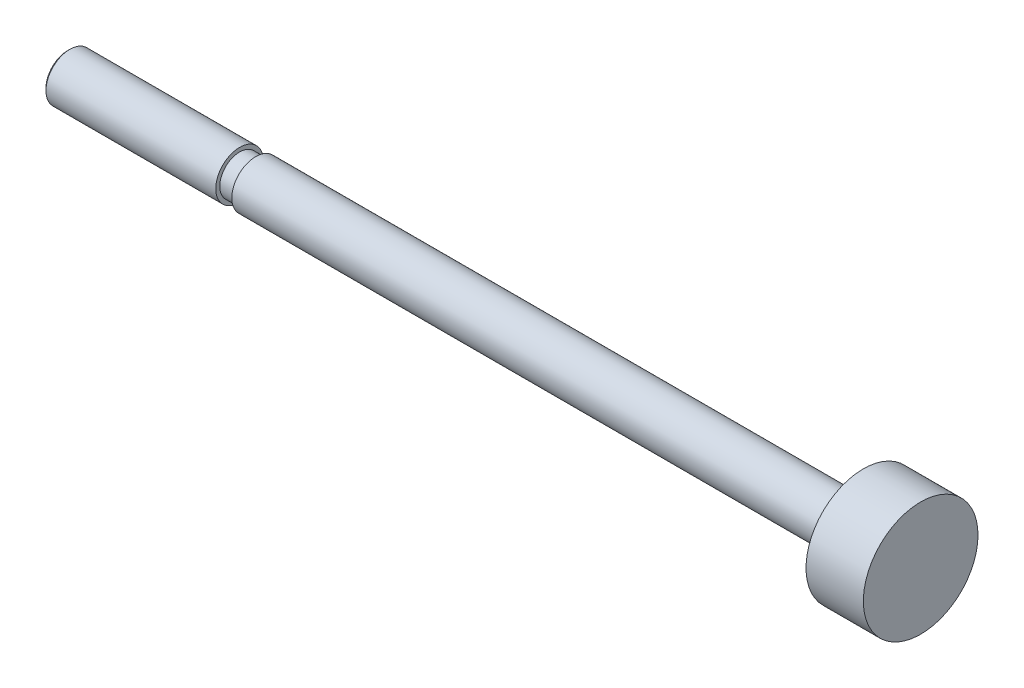
ISO-10303-21;
HEADER;
FILE_DESCRIPTION(('STEP AP214'),'2;1');
FILE_NAME('part.step','',(''),(''),'','','');
FILE_SCHEMA(('AUTOMOTIVE_DESIGN { 1 0 10303 214 1 1 1 1 }'));
ENDSEC;
DATA;
#1=APPLICATION_CONTEXT('core data for automotive mechanical design processes');
#2=APPLICATION_PROTOCOL_DEFINITION('international standard','automotive_design',2000,#1);
#3=PRODUCT_CONTEXT('',#1,'mechanical');
#4=PRODUCT('Part','Part','',(#3));
#5=PRODUCT_RELATED_PRODUCT_CATEGORY('part','',(#4));
#6=PRODUCT_DEFINITION_FORMATION('','',#4);
#7=PRODUCT_DEFINITION_CONTEXT('part definition',#1,'design');
#8=PRODUCT_DEFINITION('design','',#6,#7);
#9=PRODUCT_DEFINITION_SHAPE('','',#8);
#10=(LENGTH_UNIT() NAMED_UNIT(*) SI_UNIT(.MILLI.,.METRE.));
#11=(NAMED_UNIT(*) PLANE_ANGLE_UNIT() SI_UNIT($,.RADIAN.));
#12=(NAMED_UNIT(*) SI_UNIT($,.STERADIAN.) SOLID_ANGLE_UNIT());
#13=UNCERTAINTY_MEASURE_WITH_UNIT(LENGTH_MEASURE(1.E-05),#10,'distance_accuracy_value','');
#14=(GEOMETRIC_REPRESENTATION_CONTEXT(3) GLOBAL_UNCERTAINTY_ASSIGNED_CONTEXT((#13)) GLOBAL_UNIT_ASSIGNED_CONTEXT((#10,
#11,#12)) REPRESENTATION_CONTEXT('',''));
#15=CARTESIAN_POINT('',(0.,0.,0.));
#16=DIRECTION('',(0.,0.,1.));
#17=DIRECTION('',(1.,0.,0.));
#18=AXIS2_PLACEMENT_3D('',#15,#16,#17);
#19=CARTESIAN_POINT('',(-4.99999,0.,0.));
#20=DIRECTION('',(1.,0.,0.));
#21=DIRECTION('',(0.,0.,-1.));
#22=AXIS2_PLACEMENT_3D('',#19,#20,#21);
#23=CYLINDRICAL_SURFACE('',#22,4.99999);
#24=CARTESIAN_POINT('',(-4.99999,0.,0.));
#25=DIRECTION('',(1.,0.,0.));
#26=DIRECTION('',(0.,0.,-1.));
#27=AXIS2_PLACEMENT_3D('',#24,#25,#26);
#28=CIRCLE('',#27,4.99999);
#29=CARTESIAN_POINT('',(-4.99999,0.,-4.99999));
#30=VERTEX_POINT('',#29);
#31=EDGE_CURVE('E59',#30,#30,#28,.T.);
#32=ORIENTED_EDGE('',*,*,#31,.T.);
#33=EDGE_LOOP('',(#32));
#34=FACE_BOUND('',#33,.T.);
#35=CARTESIAN_POINT('',(0.,0.,0.));
#36=DIRECTION('',(1.,0.,0.));
#37=DIRECTION('',(0.,0.,-1.));
#38=AXIS2_PLACEMENT_3D('',#35,#36,#37);
#39=CIRCLE('',#38,4.99999);
#40=CARTESIAN_POINT('',(0.,0.,-4.99999));
#41=VERTEX_POINT('',#40);
#42=EDGE_CURVE('E60',#41,#41,#39,.T.);
#43=ORIENTED_EDGE('',*,*,#42,.F.);
#44=EDGE_LOOP('',(#43));
#45=FACE_BOUND('',#44,.T.);
#46=ADVANCED_FACE('F38',(#34,#45),#23,.T.);
#47=CARTESIAN_POINT('',(-4.99999,0.,0.));
#48=DIRECTION('',(1.,0.,0.));
#49=DIRECTION('',(0.,0.,-1.));
#50=AXIS2_PLACEMENT_3D('',#47,#48,#49);
#51=PLANE('',#50);
#52=CARTESIAN_POINT('',(-4.99999,0.,0.));
#53=DIRECTION('',(1.,0.,0.));
#54=DIRECTION('',(0.,0.,-1.));
#55=AXIS2_PLACEMENT_3D('',#52,#53,#54);
#56=CIRCLE('',#55,2.0828);
#57=CARTESIAN_POINT('',(-4.99999,0.,-2.0828));
#58=VERTEX_POINT('',#57);
#59=EDGE_CURVE('E63',#58,#58,#56,.T.);
#60=ORIENTED_EDGE('',*,*,#59,.T.);
#61=EDGE_LOOP('',(#60));
#62=FACE_BOUND('',#61,.T.);
#63=ORIENTED_EDGE('',*,*,#31,.F.);
#64=EDGE_LOOP('',(#63));
#65=FACE_BOUND('',#64,.T.);
#66=ADVANCED_FACE('F95',(#62,#65),#51,.F.);
#67=CARTESIAN_POINT('',(0.,0.,0.));
#68=DIRECTION('',(1.,0.,0.));
#69=DIRECTION('',(0.,0.,-1.));
#70=AXIS2_PLACEMENT_3D('',#67,#68,#69);
#71=PLANE('',#70);
#72=ORIENTED_EDGE('',*,*,#42,.T.);
#73=EDGE_LOOP('',(#72));
#74=FACE_BOUND('',#73,.T.);
#75=ADVANCED_FACE('F101',(#74),#71,.T.);
#76=CARTESIAN_POINT('',(-57.999884,0.,0.));
#77=DIRECTION('',(1.,0.,0.));
#78=DIRECTION('',(0.,0.,-1.));
#79=AXIS2_PLACEMENT_3D('',#76,#77,#78);
#80=CYLINDRICAL_SURFACE('',#79,2.0828);
#81=CARTESIAN_POINT('',(-57.999884,0.,0.));
#82=DIRECTION('',(1.,0.,0.));
#83=DIRECTION('',(0.,0.,-1.));
#84=AXIS2_PLACEMENT_3D('',#81,#82,#83);
#85=CIRCLE('',#84,2.0828);
#86=CARTESIAN_POINT('',(-57.999884,0.,-2.0828));
#87=VERTEX_POINT('',#86);
#88=EDGE_CURVE('E68',#87,#87,#85,.T.);
#89=ORIENTED_EDGE('',*,*,#88,.T.);
#90=EDGE_LOOP('',(#89));
#91=FACE_BOUND('',#90,.T.);
#92=ORIENTED_EDGE('',*,*,#59,.F.);
#93=EDGE_LOOP('',(#92));
#94=FACE_BOUND('',#93,.T.);
#95=ADVANCED_FACE('F124',(#91,#94),#80,.T.);
#96=CARTESIAN_POINT('',(-57.999884,0.,0.));
#97=DIRECTION('',(1.,0.,0.));
#98=DIRECTION('',(0.,0.,-1.));
#99=AXIS2_PLACEMENT_3D('',#96,#97,#98);
#100=PLANE('',#99);
#101=CARTESIAN_POINT('',(-57.999884,0.,0.));
#102=DIRECTION('',(1.,0.,0.));
#103=DIRECTION('',(0.,0.,-1.));
#104=AXIS2_PLACEMENT_3D('',#101,#102,#103);
#105=CIRCLE('',#104,1.929511);
#106=CARTESIAN_POINT('',(-57.999884,0.,-1.929511));
#107=VERTEX_POINT('',#106);
#108=EDGE_CURVE('E54',#107,#107,#105,.T.);
#109=ORIENTED_EDGE('',*,*,#108,.T.);
#110=EDGE_LOOP('',(#109));
#111=FACE_BOUND('',#110,.T.);
#112=ORIENTED_EDGE('',*,*,#88,.F.);
#113=EDGE_LOOP('',(#112));
#114=FACE_BOUND('',#113,.T.);
#115=ADVANCED_FACE('F90',(#111,#114),#100,.F.);
#116=CARTESIAN_POINT('',(-59.399678,0.,0.));
#117=DIRECTION('',(1.,0.,0.));
#118=DIRECTION('',(0.,0.,-1.));
#119=AXIS2_PLACEMENT_3D('',#116,#117,#118);
#120=CYLINDRICAL_SURFACE('',#119,1.732788);
#121=CARTESIAN_POINT('',(-58.196607,0.,0.));
#122=DIRECTION('',(1.,0.,0.));
#123=DIRECTION('',(0.,0.,-1.));
#124=AXIS2_PLACEMENT_3D('',#121,#122,#123);
#125=CIRCLE('',#124,1.732788);
#126=CARTESIAN_POINT('',(-58.196607,0.,-1.732788));
#127=VERTEX_POINT('',#126);
#128=EDGE_CURVE('E50',#127,#127,#125,.F.);
#129=ORIENTED_EDGE('',*,*,#128,.T.);
#130=EDGE_LOOP('',(#129));
#131=FACE_BOUND('',#130,.T.);
#132=CARTESIAN_POINT('',(-59.399678,0.,0.));
#133=DIRECTION('',(1.,0.,0.));
#134=DIRECTION('',(0.,0.,-1.));
#135=AXIS2_PLACEMENT_3D('',#132,#133,#134);
#136=CIRCLE('',#135,1.732788);
#137=CARTESIAN_POINT('',(-59.399678,0.,-1.732788));
#138=VERTEX_POINT('',#137);
#139=EDGE_CURVE('E71',#138,#138,#136,.T.);
#140=ORIENTED_EDGE('',*,*,#139,.T.);
#141=EDGE_LOOP('',(#140));
#142=FACE_BOUND('',#141,.T.);
#143=ADVANCED_FACE('F83',(#131,#142),#120,.T.);
#144=CARTESIAN_POINT('',(-74.399648,0.,0.));
#145=DIRECTION('',(1.,0.,0.));
#146=DIRECTION('',(0.,0.,-1.));
#147=AXIS2_PLACEMENT_3D('',#144,#145,#146);
#148=CYLINDRICAL_SURFACE('',#147,2.0828);
#149=CARTESIAN_POINT('',(-74.209148,0.,0.));
#150=DIRECTION('',(1.,0.,0.));
#151=DIRECTION('',(0.,0.,-1.));
#152=AXIS2_PLACEMENT_3D('',#149,#150,#151);
#153=CIRCLE('',#152,2.0828);
#154=CARTESIAN_POINT('',(-74.209148,0.,-2.0828));
#155=VERTEX_POINT('',#154);
#156=EDGE_CURVE('E46',#155,#155,#153,.T.);
#157=ORIENTED_EDGE('',*,*,#156,.T.);
#158=EDGE_LOOP('',(#157));
#159=FACE_BOUND('',#158,.T.);
#160=CARTESIAN_POINT('',(-59.399678,0.,0.));
#161=DIRECTION('',(1.,0.,0.));
#162=DIRECTION('',(0.,0.,-1.));
#163=AXIS2_PLACEMENT_3D('',#160,#161,#162);
#164=CIRCLE('',#163,2.0828);
#165=CARTESIAN_POINT('',(-59.399678,0.,-2.0828));
#166=VERTEX_POINT('',#165);
#167=EDGE_CURVE('E74',#166,#166,#164,.T.);
#168=ORIENTED_EDGE('',*,*,#167,.F.);
#169=EDGE_LOOP('',(#168));
#170=FACE_BOUND('',#169,.T.);
#171=ADVANCED_FACE('F80',(#159,#170),#148,.T.);
#172=CARTESIAN_POINT('',(-74.399648,0.,0.));
#173=DIRECTION('',(1.,0.,0.));
#174=DIRECTION('',(0.,0.,-1.));
#175=AXIS2_PLACEMENT_3D('',#172,#173,#174);
#176=PLANE('',#175);
#177=CARTESIAN_POINT('',(-74.399648,0.,0.));
#178=DIRECTION('',(1.,0.,0.));
#179=DIRECTION('',(0.,0.,-1.));
#180=AXIS2_PLACEMENT_3D('',#177,#178,#179);
#181=CIRCLE('',#180,1.89230000000001);
#182=CARTESIAN_POINT('',(-74.399648,0.,-1.89230000000001));
#183=VERTEX_POINT('',#182);
#184=EDGE_CURVE('E10',#183,#183,#181,.F.);
#185=ORIENTED_EDGE('',*,*,#184,.T.);
#186=EDGE_LOOP('',(#185));
#187=FACE_BOUND('',#186,.T.);
#188=ADVANCED_FACE('F82',(#187),#176,.F.);
#189=CARTESIAN_POINT('',(-59.399678,0.,0.));
#190=DIRECTION('',(1.,0.,0.));
#191=DIRECTION('',(0.,0.,-1.));
#192=AXIS2_PLACEMENT_3D('',#189,#190,#191);
#193=PLANE('',#192);
#194=ORIENTED_EDGE('',*,*,#139,.F.);
#195=EDGE_LOOP('',(#194));
#196=FACE_BOUND('',#195,.T.);
#197=ORIENTED_EDGE('',*,*,#167,.T.);
#198=EDGE_LOOP('',(#197));
#199=FACE_BOUND('',#198,.T.);
#200=ADVANCED_FACE('F78',(#196,#199),#193,.T.);
#201=CARTESIAN_POINT('',(-57.996582,0.,0.));
#202=DIRECTION('',(1.,0.,0.));
#203=DIRECTION('',(0.,0.,-1.));
#204=AXIS2_PLACEMENT_3D('',#201,#202,#203);
#205=CONICAL_SURFACE('',#204,1.932813,0.78539816339745);
#206=ORIENTED_EDGE('',*,*,#128,.F.);
#207=EDGE_LOOP('',(#206));
#208=FACE_BOUND('',#207,.T.);
#209=ORIENTED_EDGE('',*,*,#108,.F.);
#210=EDGE_LOOP('',(#209));
#211=FACE_BOUND('',#210,.T.);
#212=ADVANCED_FACE('F107',(#208,#211),#205,.T.);
#213=CARTESIAN_POINT('',(-74.209148,0.,0.));
#214=DIRECTION('',(1.,0.,0.));
#215=DIRECTION('',(0.,0.,-1.));
#216=AXIS2_PLACEMENT_3D('',#213,#214,#215);
#217=CONICAL_SURFACE('',#216,2.0828,0.785398163397405);
#218=ORIENTED_EDGE('',*,*,#184,.F.);
#219=EDGE_LOOP('',(#218));
#220=FACE_BOUND('',#219,.T.);
#221=ORIENTED_EDGE('',*,*,#156,.F.);
#222=EDGE_LOOP('',(#221));
#223=FACE_BOUND('',#222,.T.);
#224=ADVANCED_FACE('F41',(#220,#223),#217,.T.);
#225=CLOSED_SHELL('',(#46,#66,#75,#95,#115,#143,#171,#188,#200,#212,#224));
#226=MANIFOLD_SOLID_BREP('B2',#225);
#227=ADVANCED_BREP_SHAPE_REPRESENTATION('',(#18,#226),#14);
#228=SHAPE_DEFINITION_REPRESENTATION(#9,#227);
ENDSEC;
END-ISO-10303-21;
